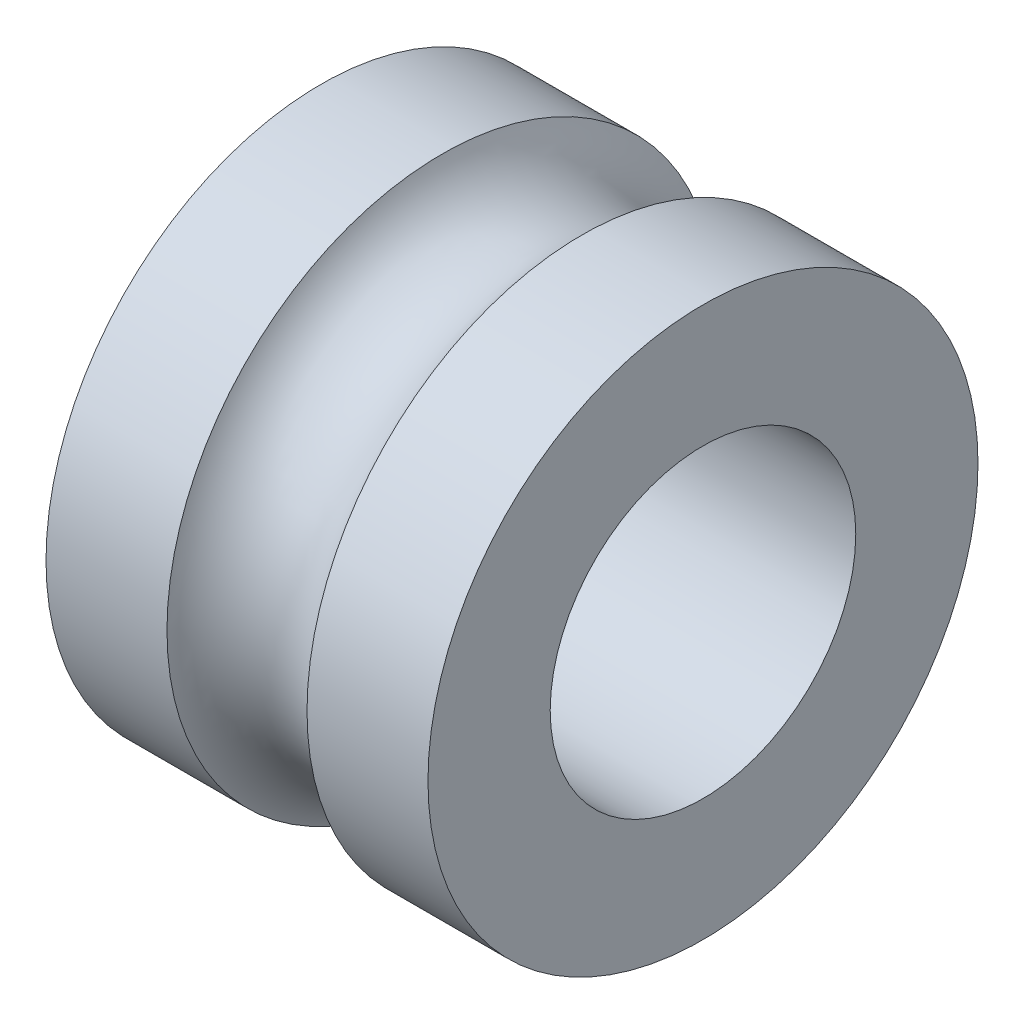
ISO-10303-21;
HEADER;
FILE_DESCRIPTION(('STEP AP214'),'2;1');
FILE_NAME('part.step','',(''),(''),'','','');
FILE_SCHEMA(('AUTOMOTIVE_DESIGN { 1 0 10303 214 1 1 1 1 }'));
ENDSEC;
DATA;
#1=APPLICATION_CONTEXT('core data for automotive mechanical design processes');
#2=APPLICATION_PROTOCOL_DEFINITION('international standard','automotive_design',2000,#1);
#3=PRODUCT_CONTEXT('',#1,'mechanical');
#4=PRODUCT('Part','Part','',(#3));
#5=PRODUCT_RELATED_PRODUCT_CATEGORY('part','',(#4));
#6=PRODUCT_DEFINITION_FORMATION('','',#4);
#7=PRODUCT_DEFINITION_CONTEXT('part definition',#1,'design');
#8=PRODUCT_DEFINITION('design','',#6,#7);
#9=PRODUCT_DEFINITION_SHAPE('','',#8);
#10=(LENGTH_UNIT() NAMED_UNIT(*) SI_UNIT(.MILLI.,.METRE.));
#11=(NAMED_UNIT(*) PLANE_ANGLE_UNIT() SI_UNIT($,.RADIAN.));
#12=(NAMED_UNIT(*) SI_UNIT($,.STERADIAN.) SOLID_ANGLE_UNIT());
#13=UNCERTAINTY_MEASURE_WITH_UNIT(LENGTH_MEASURE(1.E-05),#10,'distance_accuracy_value','');
#14=(GEOMETRIC_REPRESENTATION_CONTEXT(3) GLOBAL_UNCERTAINTY_ASSIGNED_CONTEXT((#13)) GLOBAL_UNIT_ASSIGNED_CONTEXT((#10,
#11,#12)) REPRESENTATION_CONTEXT('',''));
#15=CARTESIAN_POINT('',(0.,0.,0.));
#16=DIRECTION('',(0.,0.,1.));
#17=DIRECTION('',(1.,0.,0.));
#18=AXIS2_PLACEMENT_3D('',#15,#16,#17);
#19=CARTESIAN_POINT('',(-12.5,18.,0.));
#20=DIRECTION('',(1.,0.,0.));
#21=DIRECTION('',(0.,0.,-1.));
#22=AXIS2_PLACEMENT_3D('',#19,#20,#21);
#23=PLANE('',#22);
#24=CARTESIAN_POINT('',(-12.5,0.,0.));
#25=DIRECTION('',(-1.,0.,0.));
#26=DIRECTION('',(0.,0.,1.));
#27=AXIS2_PLACEMENT_3D('',#24,#25,#26);
#28=CIRCLE('',#27,10.);
#29=CARTESIAN_POINT('',(-12.5,0.,10.));
#30=VERTEX_POINT('',#29);
#31=EDGE_CURVE('E10',#30,#30,#28,.T.);
#32=ORIENTED_EDGE('',*,*,#31,.F.);
#33=EDGE_LOOP('',(#32));
#34=FACE_BOUND('',#33,.T.);
#35=CARTESIAN_POINT('',(-12.5,0.,0.));
#36=DIRECTION('',(-1.,0.,0.));
#37=DIRECTION('',(0.,0.,1.));
#38=AXIS2_PLACEMENT_3D('',#35,#36,#37);
#39=CIRCLE('',#38,18.);
#40=CARTESIAN_POINT('',(-12.5,0.,18.));
#41=VERTEX_POINT('',#40);
#42=EDGE_CURVE('E53',#41,#41,#39,.T.);
#43=ORIENTED_EDGE('',*,*,#42,.T.);
#44=EDGE_LOOP('',(#43));
#45=FACE_BOUND('',#44,.T.);
#46=ADVANCED_FACE('F31',(#34,#45),#23,.F.);
#47=CARTESIAN_POINT('',(-36.4354791790183,0.,0.));
#48=DIRECTION('',(-1.,0.,0.));
#49=DIRECTION('',(0.,0.,1.));
#50=AXIS2_PLACEMENT_3D('',#47,#48,#49);
#51=CYLINDRICAL_SURFACE('',#50,10.);
#52=CARTESIAN_POINT('',(12.5,0.,0.));
#53=DIRECTION('',(-1.,0.,0.));
#54=DIRECTION('',(0.,0.,1.));
#55=AXIS2_PLACEMENT_3D('',#52,#53,#54);
#56=CIRCLE('',#55,10.);
#57=CARTESIAN_POINT('',(12.5,0.,10.));
#58=VERTEX_POINT('',#57);
#59=EDGE_CURVE('E37',#58,#58,#56,.T.);
#60=ORIENTED_EDGE('',*,*,#59,.F.);
#61=EDGE_LOOP('',(#60));
#62=FACE_BOUND('',#61,.T.);
#63=ORIENTED_EDGE('',*,*,#31,.T.);
#64=EDGE_LOOP('',(#63));
#65=FACE_BOUND('',#64,.T.);
#66=ADVANCED_FACE('F78',(#62,#65),#51,.F.);
#67=CARTESIAN_POINT('',(12.5,18.,0.));
#68=DIRECTION('',(-1.,0.,0.));
#69=DIRECTION('',(0.,0.,1.));
#70=AXIS2_PLACEMENT_3D('',#67,#68,#69);
#71=PLANE('',#70);
#72=CARTESIAN_POINT('',(12.5,0.,0.));
#73=DIRECTION('',(-1.,0.,0.));
#74=DIRECTION('',(0.,0.,1.));
#75=AXIS2_PLACEMENT_3D('',#72,#73,#74);
#76=CIRCLE('',#75,18.);
#77=CARTESIAN_POINT('',(12.5,0.,18.));
#78=VERTEX_POINT('',#77);
#79=EDGE_CURVE('E41',#78,#78,#76,.T.);
#80=ORIENTED_EDGE('',*,*,#79,.F.);
#81=EDGE_LOOP('',(#80));
#82=FACE_BOUND('',#81,.T.);
#83=ORIENTED_EDGE('',*,*,#59,.T.);
#84=EDGE_LOOP('',(#83));
#85=FACE_BOUND('',#84,.T.);
#86=ADVANCED_FACE('F73',(#82,#85),#71,.F.);
#87=CARTESIAN_POINT('',(-36.4354791790183,0.,0.));
#88=DIRECTION('',(-1.,0.,0.));
#89=DIRECTION('',(0.,0.,1.));
#90=AXIS2_PLACEMENT_3D('',#87,#88,#89);
#91=CYLINDRICAL_SURFACE('',#90,18.);
#92=CARTESIAN_POINT('',(4.58257569495583,0.,0.));
#93=DIRECTION('',(-1.,0.,0.));
#94=DIRECTION('',(0.,0.,1.));
#95=AXIS2_PLACEMENT_3D('',#92,#93,#94);
#96=CIRCLE('',#95,18.);
#97=CARTESIAN_POINT('',(4.58257569495583,0.,18.));
#98=VERTEX_POINT('',#97);
#99=EDGE_CURVE('E45',#98,#98,#96,.T.);
#100=ORIENTED_EDGE('',*,*,#99,.F.);
#101=EDGE_LOOP('',(#100));
#102=FACE_BOUND('',#101,.T.);
#103=ORIENTED_EDGE('',*,*,#79,.T.);
#104=EDGE_LOOP('',(#103));
#105=FACE_BOUND('',#104,.T.);
#106=ADVANCED_FACE('F67',(#102,#105),#91,.T.);
#107=CARTESIAN_POINT('',(0.,0.,0.));
#108=DIRECTION('',(-1.,0.,0.));
#109=DIRECTION('',(0.,0.,1.));
#110=AXIS2_PLACEMENT_3D('',#107,#108,#109);
#111=TOROIDAL_SURFACE('',#110,20.,5.);
#112=CARTESIAN_POINT('',(-4.58257569495584,0.,0.));
#113=DIRECTION('',(-1.,0.,0.));
#114=DIRECTION('',(0.,0.,1.));
#115=AXIS2_PLACEMENT_3D('',#112,#113,#114);
#116=CIRCLE('',#115,18.);
#117=CARTESIAN_POINT('',(-4.58257569495584,0.,18.));
#118=VERTEX_POINT('',#117);
#119=EDGE_CURVE('E50',#118,#118,#116,.T.);
#120=ORIENTED_EDGE('',*,*,#119,.F.);
#121=EDGE_LOOP('',(#120));
#122=FACE_BOUND('',#121,.T.);
#123=ORIENTED_EDGE('',*,*,#99,.T.);
#124=EDGE_LOOP('',(#123));
#125=FACE_BOUND('',#124,.T.);
#126=ADVANCED_FACE('F61',(#122,#125),#111,.F.);
#127=CARTESIAN_POINT('',(-36.4354791790183,0.,0.));
#128=DIRECTION('',(-1.,0.,0.));
#129=DIRECTION('',(0.,0.,1.));
#130=AXIS2_PLACEMENT_3D('',#127,#128,#129);
#131=CYLINDRICAL_SURFACE('',#130,18.);
#132=ORIENTED_EDGE('',*,*,#42,.F.);
#133=EDGE_LOOP('',(#132));
#134=FACE_BOUND('',#133,.T.);
#135=ORIENTED_EDGE('',*,*,#119,.T.);
#136=EDGE_LOOP('',(#135));
#137=FACE_BOUND('',#136,.T.);
#138=ADVANCED_FACE('F58',(#134,#137),#131,.T.);
#139=CLOSED_SHELL('',(#46,#66,#86,#106,#126,#138));
#140=MANIFOLD_SOLID_BREP('B2',#139);
#141=ADVANCED_BREP_SHAPE_REPRESENTATION('',(#18,#140),#14);
#142=SHAPE_DEFINITION_REPRESENTATION(#9,#141);
ENDSEC;
END-ISO-10303-21;
